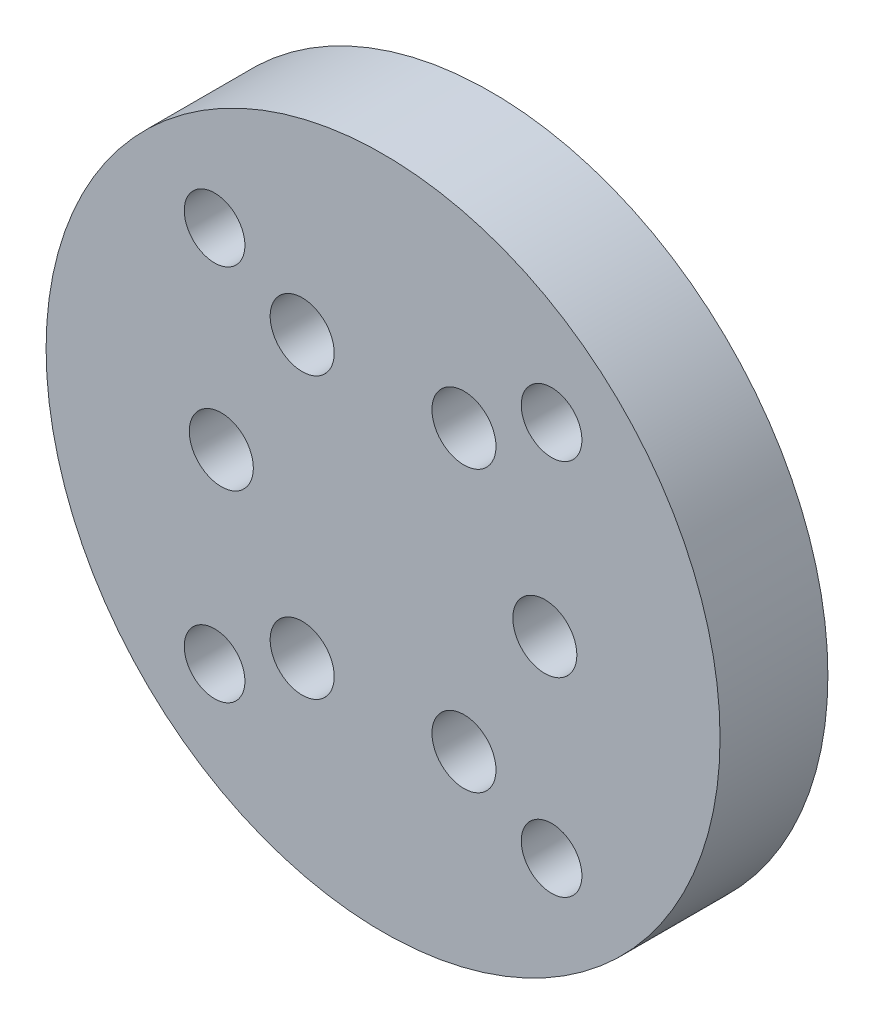
ISO-10303-21;
HEADER;
FILE_DESCRIPTION(('STEP AP214'),'2;1');
FILE_NAME('part.step','',(''),(''),'','','');
FILE_SCHEMA(('AUTOMOTIVE_DESIGN { 1 0 10303 214 1 1 1 1 }'));
ENDSEC;
DATA;
#1=APPLICATION_CONTEXT('core data for automotive mechanical design processes');
#2=APPLICATION_PROTOCOL_DEFINITION('international standard','automotive_design',2000,#1);
#3=PRODUCT_CONTEXT('',#1,'mechanical');
#4=PRODUCT('Part','Part','',(#3));
#5=PRODUCT_RELATED_PRODUCT_CATEGORY('part','',(#4));
#6=PRODUCT_DEFINITION_FORMATION('','',#4);
#7=PRODUCT_DEFINITION_CONTEXT('part definition',#1,'design');
#8=PRODUCT_DEFINITION('design','',#6,#7);
#9=PRODUCT_DEFINITION_SHAPE('','',#8);
#10=(LENGTH_UNIT() NAMED_UNIT(*) SI_UNIT(.MILLI.,.METRE.));
#11=(NAMED_UNIT(*) PLANE_ANGLE_UNIT() SI_UNIT($,.RADIAN.));
#12=(NAMED_UNIT(*) SI_UNIT($,.STERADIAN.) SOLID_ANGLE_UNIT());
#13=UNCERTAINTY_MEASURE_WITH_UNIT(LENGTH_MEASURE(1.E-05),#10,'distance_accuracy_value','');
#14=(GEOMETRIC_REPRESENTATION_CONTEXT(3) GLOBAL_UNCERTAINTY_ASSIGNED_CONTEXT((#13)) GLOBAL_UNIT_ASSIGNED_CONTEXT((#10,
#11,#12)) REPRESENTATION_CONTEXT('',''));
#15=CARTESIAN_POINT('',(0.,0.,0.));
#16=DIRECTION('',(0.,0.,1.));
#17=DIRECTION('',(1.,0.,0.));
#18=AXIS2_PLACEMENT_3D('',#15,#16,#17);
#19=CARTESIAN_POINT('',(0.,0.,0.));
#20=DIRECTION('',(0.,0.,1.));
#21=DIRECTION('',(1.,0.,0.));
#22=AXIS2_PLACEMENT_3D('',#19,#20,#21);
#23=PLANE('',#22);
#24=CARTESIAN_POINT('',(8.97198777937125,-11.4071264548756,0.));
#25=DIRECTION('',(0.,0.,1.));
#26=DIRECTION('',(1.,0.,0.));
#27=AXIS2_PLACEMENT_3D('',#24,#25,#26);
#28=CIRCLE('',#27,4.025);
#29=CARTESIAN_POINT('',(12.9969877793712,-11.4071264548756,0.));
#30=VERTEX_POINT('',#29);
#31=EDGE_CURVE('E388',#30,#30,#28,.T.);
#32=ORIENTED_EDGE('',*,*,#31,.T.);
#33=EDGE_LOOP('',(#32));
#34=FACE_BOUND('',#33,.T.);
#35=CARTESIAN_POINT('',(2.97198777937125,-21.7994313002889,0.));
#36=DIRECTION('',(0.,0.,1.));
#37=DIRECTION('',(1.,0.,0.));
#38=AXIS2_PLACEMENT_3D('',#35,#36,#37);
#39=CIRCLE('',#38,4.02500000000004);
#40=CARTESIAN_POINT('',(6.99698777937129,-21.7994313002889,0.));
#41=VERTEX_POINT('',#40);
#42=EDGE_CURVE('E274',#41,#41,#39,.T.);
#43=ORIENTED_EDGE('',*,*,#42,.T.);
#44=EDGE_LOOP('',(#43));
#45=FACE_BOUND('',#44,.T.);
#46=CARTESIAN_POINT('',(-9.02801222062875,-21.7994313002889,0.));
#47=DIRECTION('',(0.,0.,1.));
#48=DIRECTION('',(1.,0.,0.));
#49=AXIS2_PLACEMENT_3D('',#46,#47,#48);
#50=CIRCLE('',#49,4.02500000000004);
#51=CARTESIAN_POINT('',(-5.00301222062871,-21.7994313002889,0.));
#52=VERTEX_POINT('',#51);
#53=EDGE_CURVE('E261',#52,#52,#50,.T.);
#54=ORIENTED_EDGE('',*,*,#53,.T.);
#55=EDGE_LOOP('',(#54));
#56=FACE_BOUND('',#55,.T.);
#57=CARTESIAN_POINT('',(-9.02801222062876,-1.01482160946231,0.));
#58=DIRECTION('',(0.,0.,1.));
#59=DIRECTION('',(1.,0.,0.));
#60=AXIS2_PLACEMENT_3D('',#57,#58,#59);
#61=CIRCLE('',#60,4.025);
#62=CARTESIAN_POINT('',(-5.00301222062876,-1.01482160946231,0.));
#63=VERTEX_POINT('',#62);
#64=EDGE_CURVE('E268',#63,#63,#61,.T.);
#65=ORIENTED_EDGE('',*,*,#64,.T.);
#66=EDGE_LOOP('',(#65));
#67=FACE_BOUND('',#66,.T.);
#68=CARTESIAN_POINT('',(-15.0280122206288,-11.4071264548756,0.));
#69=DIRECTION('',(0.,0.,1.));
#70=DIRECTION('',(1.,0.,0.));
#71=AXIS2_PLACEMENT_3D('',#68,#69,#70);
#72=CIRCLE('',#71,4.02500000000001);
#73=CARTESIAN_POINT('',(-11.0030122206287,-11.4071264548756,0.));
#74=VERTEX_POINT('',#73);
#75=EDGE_CURVE('E382',#74,#74,#72,.T.);
#76=ORIENTED_EDGE('',*,*,#75,.T.);
#77=EDGE_LOOP('',(#76));
#78=FACE_BOUND('',#77,.T.);
#79=CARTESIAN_POINT('',(2.97198777937125,-1.01482160946231,0.));
#80=DIRECTION('',(0.,0.,1.));
#81=DIRECTION('',(1.,0.,0.));
#82=AXIS2_PLACEMENT_3D('',#79,#80,#81);
#83=CIRCLE('',#82,4.025);
#84=CARTESIAN_POINT('',(6.99698777937125,-1.01482160946231,0.));
#85=VERTEX_POINT('',#84);
#86=EDGE_CURVE('E164',#85,#85,#83,.T.);
#87=ORIENTED_EDGE('',*,*,#86,.T.);
#88=EDGE_LOOP('',(#87));
#89=FACE_BOUND('',#88,.T.);
#90=CARTESIAN_POINT('',(-3.02801222062875,-11.4071264548756,0.));
#91=DIRECTION('',(0.,0.,1.));
#92=DIRECTION('',(1.,0.,0.));
#93=AXIS2_PLACEMENT_3D('',#90,#91,#92);
#94=CIRCLE('',#93,25.);
#95=CARTESIAN_POINT('',(21.9719877793712,-11.4071264548756,0.));
#96=VERTEX_POINT('',#95);
#97=EDGE_CURVE('E98',#96,#96,#94,.T.);
#98=ORIENTED_EDGE('',*,*,#97,.F.);
#99=EDGE_LOOP('',(#98));
#100=FACE_BOUND('',#99,.T.);
#101=CARTESIAN_POINT('',(9.47198777937125,2.5928735451244,-1.20000000006226E-05));
#102=DIRECTION('',(0.,0.,-1.));
#103=DIRECTION('',(-1.,0.,0.));
#104=AXIS2_PLACEMENT_3D('',#101,#102,#103);
#105=CIRCLE('',#104,2.25);
#106=CARTESIAN_POINT('',(7.22198777937125,2.5928735451244,-1.20000000006226E-05));
#107=VERTEX_POINT('',#106);
#108=EDGE_CURVE('E102',#107,#107,#105,.T.);
#109=ORIENTED_EDGE('',*,*,#108,.F.);
#110=EDGE_LOOP('',(#109));
#111=FACE_BOUND('',#110,.T.);
#112=CARTESIAN_POINT('',(-15.5280122206287,2.5928735451244,-1.20000000006226E-05));
#113=DIRECTION('',(0.,0.,-1.));
#114=DIRECTION('',(-1.,0.,0.));
#115=AXIS2_PLACEMENT_3D('',#112,#113,#114);
#116=CIRCLE('',#115,2.25);
#117=CARTESIAN_POINT('',(-17.7780122206287,2.5928735451244,-1.20000000006226E-05));
#118=VERTEX_POINT('',#117);
#119=EDGE_CURVE('E292',#118,#118,#116,.T.);
#120=ORIENTED_EDGE('',*,*,#119,.F.);
#121=EDGE_LOOP('',(#120));
#122=FACE_BOUND('',#121,.T.);
#123=CARTESIAN_POINT('',(-15.5280122206287,-25.4071264548756,-1.20000000006226E-05));
#124=DIRECTION('',(0.,0.,-1.));
#125=DIRECTION('',(-1.,0.,0.));
#126=AXIS2_PLACEMENT_3D('',#123,#124,#125);
#127=CIRCLE('',#126,2.25);
#128=CARTESIAN_POINT('',(-17.7780122206287,-25.4071264548756,-1.20000000006226E-05));
#129=VERTEX_POINT('',#128);
#130=EDGE_CURVE('E142',#129,#129,#127,.T.);
#131=ORIENTED_EDGE('',*,*,#130,.F.);
#132=EDGE_LOOP('',(#131));
#133=FACE_BOUND('',#132,.T.);
#134=CARTESIAN_POINT('',(9.47198777937125,-25.4071264548756,-1.20000000006226E-05));
#135=DIRECTION('',(0.,0.,-1.));
#136=DIRECTION('',(-1.,0.,0.));
#137=AXIS2_PLACEMENT_3D('',#134,#135,#136);
#138=CIRCLE('',#137,2.25);
#139=CARTESIAN_POINT('',(7.22198777937125,-25.4071264548756,-1.20000000006226E-05));
#140=VERTEX_POINT('',#139);
#141=EDGE_CURVE('E155',#140,#140,#138,.T.);
#142=ORIENTED_EDGE('',*,*,#141,.F.);
#143=EDGE_LOOP('',(#142));
#144=FACE_BOUND('',#143,.T.);
#145=ADVANCED_FACE('F80',(#34,#45,#56,#67,#78,#89,#100,#111,#122,#133,#144),#23,.F.);
#146=CARTESIAN_POINT('',(-9.02801222062876,-1.01482160946231,8.));
#147=DIRECTION('',(0.,0.,-1.));
#148=DIRECTION('',(-1.,0.,0.));
#149=AXIS2_PLACEMENT_3D('',#146,#147,#148);
#150=CYLINDRICAL_SURFACE('',#149,2.375);
#151=CARTESIAN_POINT('',(-9.02801222062876,-1.01482160946231,4.));
#152=DIRECTION('',(0.,0.,1.));
#153=DIRECTION('',(1.,0.,0.));
#154=AXIS2_PLACEMENT_3D('',#151,#152,#153);
#155=CIRCLE('',#154,2.375);
#156=CARTESIAN_POINT('',(-6.65301222062875,-1.01482160946231,4.));
#157=VERTEX_POINT('',#156);
#158=EDGE_CURVE('E276',#157,#157,#155,.T.);
#159=ORIENTED_EDGE('',*,*,#158,.F.);
#160=EDGE_LOOP('',(#159));
#161=FACE_BOUND('',#160,.T.);
#162=CARTESIAN_POINT('',(-9.02801222062876,-1.01482160946231,8.));
#163=DIRECTION('',(0.,0.,1.));
#164=DIRECTION('',(1.,0.,0.));
#165=AXIS2_PLACEMENT_3D('',#162,#163,#164);
#166=CIRCLE('',#165,2.375);
#167=CARTESIAN_POINT('',(-6.65301222062875,-1.01482160946231,8.));
#168=VERTEX_POINT('',#167);
#169=EDGE_CURVE('E90',#168,#168,#166,.T.);
#170=ORIENTED_EDGE('',*,*,#169,.T.);
#171=EDGE_LOOP('',(#170));
#172=FACE_BOUND('',#171,.T.);
#173=ADVANCED_FACE('F119',(#161,#172),#150,.F.);
#174=CARTESIAN_POINT('',(2.97198777937125,-1.01482160946231,8.));
#175=DIRECTION('',(0.,0.,-1.));
#176=DIRECTION('',(-1.,0.,0.));
#177=AXIS2_PLACEMENT_3D('',#174,#175,#176);
#178=CYLINDRICAL_SURFACE('',#177,2.375);
#179=CARTESIAN_POINT('',(2.97198777937125,-1.01482160946231,4.));
#180=DIRECTION('',(0.,0.,1.));
#181=DIRECTION('',(1.,0.,0.));
#182=AXIS2_PLACEMENT_3D('',#179,#180,#181);
#183=CIRCLE('',#182,2.375);
#184=CARTESIAN_POINT('',(5.34698777937125,-1.01482160946231,4.));
#185=VERTEX_POINT('',#184);
#186=EDGE_CURVE('E282',#185,#185,#183,.T.);
#187=ORIENTED_EDGE('',*,*,#186,.F.);
#188=EDGE_LOOP('',(#187));
#189=FACE_BOUND('',#188,.T.);
#190=CARTESIAN_POINT('',(2.97198777937125,-1.01482160946231,8.));
#191=DIRECTION('',(0.,0.,1.));
#192=DIRECTION('',(1.,0.,0.));
#193=AXIS2_PLACEMENT_3D('',#190,#191,#192);
#194=CIRCLE('',#193,2.375);
#195=CARTESIAN_POINT('',(5.34698777937125,-1.01482160946231,8.));
#196=VERTEX_POINT('',#195);
#197=EDGE_CURVE('E95',#196,#196,#194,.T.);
#198=ORIENTED_EDGE('',*,*,#197,.T.);
#199=EDGE_LOOP('',(#198));
#200=FACE_BOUND('',#199,.T.);
#201=ADVANCED_FACE('F219',(#189,#200),#178,.F.);
#202=CARTESIAN_POINT('',(8.97198777937125,-11.4071264548756,8.));
#203=DIRECTION('',(0.,0.,-1.));
#204=DIRECTION('',(-1.,0.,0.));
#205=AXIS2_PLACEMENT_3D('',#202,#203,#204);
#206=CYLINDRICAL_SURFACE('',#205,2.375);
#207=CARTESIAN_POINT('',(8.97198777937125,-11.4071264548756,4.));
#208=DIRECTION('',(0.,0.,1.));
#209=DIRECTION('',(1.,0.,0.));
#210=AXIS2_PLACEMENT_3D('',#207,#208,#209);
#211=CIRCLE('',#210,2.375);
#212=CARTESIAN_POINT('',(11.3469877793713,-11.4071264548756,4.));
#213=VERTEX_POINT('',#212);
#214=EDGE_CURVE('E390',#213,#213,#211,.T.);
#215=ORIENTED_EDGE('',*,*,#214,.F.);
#216=EDGE_LOOP('',(#215));
#217=FACE_BOUND('',#216,.T.);
#218=CARTESIAN_POINT('',(8.97198777937125,-11.4071264548756,8.));
#219=DIRECTION('',(0.,0.,1.));
#220=DIRECTION('',(1.,0.,0.));
#221=AXIS2_PLACEMENT_3D('',#218,#219,#220);
#222=CIRCLE('',#221,2.375);
#223=CARTESIAN_POINT('',(11.3469877793713,-11.4071264548756,8.));
#224=VERTEX_POINT('',#223);
#225=EDGE_CURVE('E211',#224,#224,#222,.T.);
#226=ORIENTED_EDGE('',*,*,#225,.T.);
#227=EDGE_LOOP('',(#226));
#228=FACE_BOUND('',#227,.T.);
#229=ADVANCED_FACE('F233',(#217,#228),#206,.F.);
#230=CARTESIAN_POINT('',(2.97198777937125,-21.7994313002889,8.));
#231=DIRECTION('',(0.,0.,-1.));
#232=DIRECTION('',(-1.,0.,0.));
#233=AXIS2_PLACEMENT_3D('',#230,#231,#232);
#234=CYLINDRICAL_SURFACE('',#233,2.37500000000004);
#235=CARTESIAN_POINT('',(2.97198777937125,-21.7994313002889,4.));
#236=DIRECTION('',(0.,0.,1.));
#237=DIRECTION('',(1.,0.,0.));
#238=AXIS2_PLACEMENT_3D('',#235,#236,#237);
#239=CIRCLE('',#238,2.37500000000004);
#240=CARTESIAN_POINT('',(5.34698777937129,-21.7994313002889,4.));
#241=VERTEX_POINT('',#240);
#242=EDGE_CURVE('E280',#241,#241,#239,.T.);
#243=ORIENTED_EDGE('',*,*,#242,.F.);
#244=EDGE_LOOP('',(#243));
#245=FACE_BOUND('',#244,.T.);
#246=CARTESIAN_POINT('',(2.97198777937125,-21.7994313002889,8.));
#247=DIRECTION('',(0.,0.,1.));
#248=DIRECTION('',(1.,0.,0.));
#249=AXIS2_PLACEMENT_3D('',#246,#247,#248);
#250=CIRCLE('',#249,2.37500000000004);
#251=CARTESIAN_POINT('',(5.34698777937129,-21.7994313002889,8.));
#252=VERTEX_POINT('',#251);
#253=EDGE_CURVE('E212',#252,#252,#250,.T.);
#254=ORIENTED_EDGE('',*,*,#253,.T.);
#255=EDGE_LOOP('',(#254));
#256=FACE_BOUND('',#255,.T.);
#257=ADVANCED_FACE('F238',(#245,#256),#234,.F.);
#258=CARTESIAN_POINT('',(-9.02801222062875,-21.7994313002889,8.));
#259=DIRECTION('',(0.,0.,-1.));
#260=DIRECTION('',(-1.,0.,0.));
#261=AXIS2_PLACEMENT_3D('',#258,#259,#260);
#262=CYLINDRICAL_SURFACE('',#261,2.37500000000004);
#263=CARTESIAN_POINT('',(-9.02801222062875,-21.7994313002889,4.));
#264=DIRECTION('',(0.,0.,1.));
#265=DIRECTION('',(1.,0.,0.));
#266=AXIS2_PLACEMENT_3D('',#263,#264,#265);
#267=CIRCLE('',#266,2.37500000000004);
#268=CARTESIAN_POINT('',(-6.65301222062871,-21.7994313002889,4.));
#269=VERTEX_POINT('',#268);
#270=EDGE_CURVE('E254',#269,#269,#267,.T.);
#271=ORIENTED_EDGE('',*,*,#270,.F.);
#272=EDGE_LOOP('',(#271));
#273=FACE_BOUND('',#272,.T.);
#274=CARTESIAN_POINT('',(-9.02801222062875,-21.7994313002889,8.));
#275=DIRECTION('',(0.,0.,1.));
#276=DIRECTION('',(1.,0.,0.));
#277=AXIS2_PLACEMENT_3D('',#274,#275,#276);
#278=CIRCLE('',#277,2.37500000000004);
#279=CARTESIAN_POINT('',(-6.65301222062871,-21.7994313002889,8.));
#280=VERTEX_POINT('',#279);
#281=EDGE_CURVE('E206',#280,#280,#278,.T.);
#282=ORIENTED_EDGE('',*,*,#281,.T.);
#283=EDGE_LOOP('',(#282));
#284=FACE_BOUND('',#283,.T.);
#285=ADVANCED_FACE('F241',(#273,#284),#262,.F.);
#286=CARTESIAN_POINT('',(-3.02801222062875,-11.4071264548756,8.));
#287=DIRECTION('',(0.,0.,-1.));
#288=DIRECTION('',(-1.,0.,0.));
#289=AXIS2_PLACEMENT_3D('',#286,#287,#288);
#290=CYLINDRICAL_SURFACE('',#289,25.);
#291=CARTESIAN_POINT('',(-3.02801222062875,-11.4071264548756,8.));
#292=DIRECTION('',(0.,0.,1.));
#293=DIRECTION('',(1.,0.,0.));
#294=AXIS2_PLACEMENT_3D('',#291,#292,#293);
#295=CIRCLE('',#294,25.);
#296=CARTESIAN_POINT('',(21.9719877793712,-11.4071264548756,8.));
#297=VERTEX_POINT('',#296);
#298=EDGE_CURVE('E100',#297,#297,#295,.T.);
#299=ORIENTED_EDGE('',*,*,#298,.F.);
#300=EDGE_LOOP('',(#299));
#301=FACE_BOUND('',#300,.T.);
#302=ORIENTED_EDGE('',*,*,#97,.T.);
#303=EDGE_LOOP('',(#302));
#304=FACE_BOUND('',#303,.T.);
#305=ADVANCED_FACE('F79',(#301,#304),#290,.T.);
#306=CARTESIAN_POINT('',(-15.0280122206288,-11.4071264548756,8.));
#307=DIRECTION('',(0.,0.,-1.));
#308=DIRECTION('',(-1.,0.,0.));
#309=AXIS2_PLACEMENT_3D('',#306,#307,#308);
#310=CYLINDRICAL_SURFACE('',#309,2.37500000000001);
#311=CARTESIAN_POINT('',(-15.0280122206288,-11.4071264548756,4.));
#312=DIRECTION('',(0.,0.,1.));
#313=DIRECTION('',(1.,0.,0.));
#314=AXIS2_PLACEMENT_3D('',#311,#312,#313);
#315=CIRCLE('',#314,2.37500000000001);
#316=CARTESIAN_POINT('',(-12.6530122206287,-11.4071264548756,4.));
#317=VERTEX_POINT('',#316);
#318=EDGE_CURVE('E378',#317,#317,#315,.T.);
#319=ORIENTED_EDGE('',*,*,#318,.F.);
#320=EDGE_LOOP('',(#319));
#321=FACE_BOUND('',#320,.T.);
#322=CARTESIAN_POINT('',(-15.0280122206288,-11.4071264548756,8.));
#323=DIRECTION('',(0.,0.,1.));
#324=DIRECTION('',(1.,0.,0.));
#325=AXIS2_PLACEMENT_3D('',#322,#323,#324);
#326=CIRCLE('',#325,2.37500000000001);
#327=CARTESIAN_POINT('',(-12.6530122206287,-11.4071264548756,8.));
#328=VERTEX_POINT('',#327);
#329=EDGE_CURVE('E11',#328,#328,#326,.T.);
#330=ORIENTED_EDGE('',*,*,#329,.T.);
#331=EDGE_LOOP('',(#330));
#332=FACE_BOUND('',#331,.T.);
#333=ADVANCED_FACE('F121',(#321,#332),#310,.F.);
#334=CARTESIAN_POINT('',(0.,0.,8.));
#335=DIRECTION('',(0.,0.,1.));
#336=DIRECTION('',(1.,0.,0.));
#337=AXIS2_PLACEMENT_3D('',#334,#335,#336);
#338=PLANE('',#337);
#339=CARTESIAN_POINT('',(9.47198777937125,-25.4071264548756,8.));
#340=DIRECTION('',(0.,0.,-1.));
#341=DIRECTION('',(-1.,0.,0.));
#342=AXIS2_PLACEMENT_3D('',#339,#340,#341);
#343=CIRCLE('',#342,2.25);
#344=CARTESIAN_POINT('',(7.22198777937125,-25.4071264548756,8.));
#345=VERTEX_POINT('',#344);
#346=EDGE_CURVE('E158',#345,#345,#343,.T.);
#347=ORIENTED_EDGE('',*,*,#346,.T.);
#348=EDGE_LOOP('',(#347));
#349=FACE_BOUND('',#348,.T.);
#350=CARTESIAN_POINT('',(-15.5280122206287,-25.4071264548756,8.));
#351=DIRECTION('',(0.,0.,-1.));
#352=DIRECTION('',(-1.,0.,0.));
#353=AXIS2_PLACEMENT_3D('',#350,#351,#352);
#354=CIRCLE('',#353,2.25);
#355=CARTESIAN_POINT('',(-17.7780122206287,-25.4071264548756,8.));
#356=VERTEX_POINT('',#355);
#357=EDGE_CURVE('E152',#356,#356,#354,.T.);
#358=ORIENTED_EDGE('',*,*,#357,.T.);
#359=EDGE_LOOP('',(#358));
#360=FACE_BOUND('',#359,.T.);
#361=CARTESIAN_POINT('',(-15.5280122206287,2.5928735451244,8.));
#362=DIRECTION('',(0.,0.,-1.));
#363=DIRECTION('',(-1.,0.,0.));
#364=AXIS2_PLACEMENT_3D('',#361,#362,#363);
#365=CIRCLE('',#364,2.25);
#366=CARTESIAN_POINT('',(-17.7780122206287,2.5928735451244,8.));
#367=VERTEX_POINT('',#366);
#368=EDGE_CURVE('E287',#367,#367,#365,.T.);
#369=ORIENTED_EDGE('',*,*,#368,.T.);
#370=EDGE_LOOP('',(#369));
#371=FACE_BOUND('',#370,.T.);
#372=CARTESIAN_POINT('',(9.47198777937125,2.5928735451244,8.));
#373=DIRECTION('',(0.,0.,-1.));
#374=DIRECTION('',(-1.,0.,0.));
#375=AXIS2_PLACEMENT_3D('',#372,#373,#374);
#376=CIRCLE('',#375,2.25);
#377=CARTESIAN_POINT('',(7.22198777937125,2.5928735451244,8.));
#378=VERTEX_POINT('',#377);
#379=EDGE_CURVE('E99',#378,#378,#376,.T.);
#380=ORIENTED_EDGE('',*,*,#379,.T.);
#381=EDGE_LOOP('',(#380));
#382=FACE_BOUND('',#381,.T.);
#383=ORIENTED_EDGE('',*,*,#298,.T.);
#384=EDGE_LOOP('',(#383));
#385=FACE_BOUND('',#384,.T.);
#386=ORIENTED_EDGE('',*,*,#281,.F.);
#387=EDGE_LOOP('',(#386));
#388=FACE_BOUND('',#387,.T.);
#389=ORIENTED_EDGE('',*,*,#253,.F.);
#390=EDGE_LOOP('',(#389));
#391=FACE_BOUND('',#390,.T.);
#392=ORIENTED_EDGE('',*,*,#225,.F.);
#393=EDGE_LOOP('',(#392));
#394=FACE_BOUND('',#393,.T.);
#395=ORIENTED_EDGE('',*,*,#197,.F.);
#396=EDGE_LOOP('',(#395));
#397=FACE_BOUND('',#396,.T.);
#398=ORIENTED_EDGE('',*,*,#169,.F.);
#399=EDGE_LOOP('',(#398));
#400=FACE_BOUND('',#399,.T.);
#401=ORIENTED_EDGE('',*,*,#329,.F.);
#402=EDGE_LOOP('',(#401));
#403=FACE_BOUND('',#402,.T.);
#404=ADVANCED_FACE('F125',(#349,#360,#371,#382,#385,#388,#391,#394,#397,#400,#403),#338,.T.);
#405=CARTESIAN_POINT('',(9.47198777937125,2.5928735451244,8.));
#406=DIRECTION('',(0.,0.,-1.));
#407=DIRECTION('',(-1.,0.,0.));
#408=AXIS2_PLACEMENT_3D('',#405,#406,#407);
#409=CYLINDRICAL_SURFACE('',#408,2.25);
#410=ORIENTED_EDGE('',*,*,#379,.F.);
#411=EDGE_LOOP('',(#410));
#412=FACE_BOUND('',#411,.T.);
#413=ORIENTED_EDGE('',*,*,#108,.T.);
#414=EDGE_LOOP('',(#413));
#415=FACE_BOUND('',#414,.T.);
#416=ADVANCED_FACE('F188',(#412,#415),#409,.F.);
#417=CARTESIAN_POINT('',(-15.5280122206287,2.5928735451244,8.));
#418=DIRECTION('',(0.,0.,-1.));
#419=DIRECTION('',(-1.,0.,0.));
#420=AXIS2_PLACEMENT_3D('',#417,#418,#419);
#421=CYLINDRICAL_SURFACE('',#420,2.25);
#422=ORIENTED_EDGE('',*,*,#368,.F.);
#423=EDGE_LOOP('',(#422));
#424=FACE_BOUND('',#423,.T.);
#425=ORIENTED_EDGE('',*,*,#119,.T.);
#426=EDGE_LOOP('',(#425));
#427=FACE_BOUND('',#426,.T.);
#428=ADVANCED_FACE('F194',(#424,#427),#421,.F.);
#429=CARTESIAN_POINT('',(-15.5280122206287,-25.4071264548756,8.));
#430=DIRECTION('',(0.,0.,-1.));
#431=DIRECTION('',(-1.,0.,0.));
#432=AXIS2_PLACEMENT_3D('',#429,#430,#431);
#433=CYLINDRICAL_SURFACE('',#432,2.25);
#434=ORIENTED_EDGE('',*,*,#357,.F.);
#435=EDGE_LOOP('',(#434));
#436=FACE_BOUND('',#435,.T.);
#437=ORIENTED_EDGE('',*,*,#130,.T.);
#438=EDGE_LOOP('',(#437));
#439=FACE_BOUND('',#438,.T.);
#440=ADVANCED_FACE('F187',(#436,#439),#433,.F.);
#441=CARTESIAN_POINT('',(9.47198777937125,-25.4071264548756,8.));
#442=DIRECTION('',(0.,0.,-1.));
#443=DIRECTION('',(-1.,0.,0.));
#444=AXIS2_PLACEMENT_3D('',#441,#442,#443);
#445=CYLINDRICAL_SURFACE('',#444,2.25);
#446=ORIENTED_EDGE('',*,*,#346,.F.);
#447=EDGE_LOOP('',(#446));
#448=FACE_BOUND('',#447,.T.);
#449=ORIENTED_EDGE('',*,*,#141,.T.);
#450=EDGE_LOOP('',(#449));
#451=FACE_BOUND('',#450,.T.);
#452=ADVANCED_FACE('F176',(#448,#451),#445,.F.);
#453=CARTESIAN_POINT('',(-15.0280122206288,-11.4071264548756,4.));
#454=DIRECTION('',(0.,0.,1.));
#455=DIRECTION('',(1.,0.,0.));
#456=AXIS2_PLACEMENT_3D('',#453,#454,#455);
#457=PLANE('',#456);
#458=CARTESIAN_POINT('',(-15.0280122206288,-11.4071264548756,4.));
#459=DIRECTION('',(0.,0.,1.));
#460=DIRECTION('',(1.,0.,0.));
#461=AXIS2_PLACEMENT_3D('',#458,#459,#460);
#462=CIRCLE('',#461,4.02500000000001);
#463=CARTESIAN_POINT('',(-11.0030122206287,-11.4071264548756,4.));
#464=VERTEX_POINT('',#463);
#465=EDGE_CURVE('E283',#464,#464,#462,.T.);
#466=ORIENTED_EDGE('',*,*,#465,.F.);
#467=EDGE_LOOP('',(#466));
#468=FACE_BOUND('',#467,.T.);
#469=ORIENTED_EDGE('',*,*,#318,.T.);
#470=EDGE_LOOP('',(#469));
#471=FACE_BOUND('',#470,.T.);
#472=ADVANCED_FACE('F184',(#468,#471),#457,.F.);
#473=CARTESIAN_POINT('',(-15.0280122206288,-11.4071264548756,4.));
#474=DIRECTION('',(0.,0.,-1.));
#475=DIRECTION('',(-1.,0.,0.));
#476=AXIS2_PLACEMENT_3D('',#473,#474,#475);
#477=CYLINDRICAL_SURFACE('',#476,4.02500000000001);
#478=ORIENTED_EDGE('',*,*,#465,.T.);
#479=EDGE_LOOP('',(#478));
#480=FACE_BOUND('',#479,.T.);
#481=ORIENTED_EDGE('',*,*,#75,.F.);
#482=EDGE_LOOP('',(#481));
#483=FACE_BOUND('',#482,.T.);
#484=ADVANCED_FACE('F353',(#480,#483),#477,.F.);
#485=CARTESIAN_POINT('',(-9.02801222062875,-21.7994313002889,4.));
#486=DIRECTION('',(0.,0.,1.));
#487=DIRECTION('',(1.,0.,0.));
#488=AXIS2_PLACEMENT_3D('',#485,#486,#487);
#489=PLANE('',#488);
#490=CARTESIAN_POINT('',(-9.02801222062875,-21.7994313002889,4.));
#491=DIRECTION('',(0.,0.,1.));
#492=DIRECTION('',(1.,0.,0.));
#493=AXIS2_PLACEMENT_3D('',#490,#491,#492);
#494=CIRCLE('',#493,4.02500000000004);
#495=CARTESIAN_POINT('',(-5.00301222062871,-21.7994313002889,4.));
#496=VERTEX_POINT('',#495);
#497=EDGE_CURVE('E269',#496,#496,#494,.T.);
#498=ORIENTED_EDGE('',*,*,#497,.F.);
#499=EDGE_LOOP('',(#498));
#500=FACE_BOUND('',#499,.T.);
#501=ORIENTED_EDGE('',*,*,#270,.T.);
#502=EDGE_LOOP('',(#501));
#503=FACE_BOUND('',#502,.T.);
#504=ADVANCED_FACE('F350',(#500,#503),#489,.F.);
#505=CARTESIAN_POINT('',(-9.02801222062875,-21.7994313002889,4.));
#506=DIRECTION('',(0.,0.,-1.));
#507=DIRECTION('',(-1.,0.,0.));
#508=AXIS2_PLACEMENT_3D('',#505,#506,#507);
#509=CYLINDRICAL_SURFACE('',#508,4.02500000000004);
#510=ORIENTED_EDGE('',*,*,#497,.T.);
#511=EDGE_LOOP('',(#510));
#512=FACE_BOUND('',#511,.T.);
#513=ORIENTED_EDGE('',*,*,#53,.F.);
#514=EDGE_LOOP('',(#513));
#515=FACE_BOUND('',#514,.T.);
#516=ADVANCED_FACE('F344',(#512,#515),#509,.F.);
#517=CARTESIAN_POINT('',(2.97198777937125,-21.7994313002889,4.));
#518=DIRECTION('',(0.,0.,1.));
#519=DIRECTION('',(1.,0.,0.));
#520=AXIS2_PLACEMENT_3D('',#517,#518,#519);
#521=PLANE('',#520);
#522=CARTESIAN_POINT('',(2.97198777937125,-21.7994313002889,4.));
#523=DIRECTION('',(0.,0.,1.));
#524=DIRECTION('',(1.,0.,0.));
#525=AXIS2_PLACEMENT_3D('',#522,#523,#524);
#526=CIRCLE('',#525,4.02500000000004);
#527=CARTESIAN_POINT('',(6.99698777937129,-21.7994313002889,4.));
#528=VERTEX_POINT('',#527);
#529=EDGE_CURVE('E393',#528,#528,#526,.T.);
#530=ORIENTED_EDGE('',*,*,#529,.F.);
#531=EDGE_LOOP('',(#530));
#532=FACE_BOUND('',#531,.T.);
#533=ORIENTED_EDGE('',*,*,#242,.T.);
#534=EDGE_LOOP('',(#533));
#535=FACE_BOUND('',#534,.T.);
#536=ADVANCED_FACE('F348',(#532,#535),#521,.F.);
#537=CARTESIAN_POINT('',(2.97198777937125,-21.7994313002889,4.));
#538=DIRECTION('',(0.,0.,-1.));
#539=DIRECTION('',(-1.,0.,0.));
#540=AXIS2_PLACEMENT_3D('',#537,#538,#539);
#541=CYLINDRICAL_SURFACE('',#540,4.02500000000004);
#542=ORIENTED_EDGE('',*,*,#529,.T.);
#543=EDGE_LOOP('',(#542));
#544=FACE_BOUND('',#543,.T.);
#545=ORIENTED_EDGE('',*,*,#42,.F.);
#546=EDGE_LOOP('',(#545));
#547=FACE_BOUND('',#546,.T.);
#548=ADVANCED_FACE('F351',(#544,#547),#541,.F.);
#549=CARTESIAN_POINT('',(8.97198777937125,-11.4071264548756,4.));
#550=DIRECTION('',(0.,0.,1.));
#551=DIRECTION('',(1.,0.,0.));
#552=AXIS2_PLACEMENT_3D('',#549,#550,#551);
#553=PLANE('',#552);
#554=CARTESIAN_POINT('',(8.97198777937125,-11.4071264548756,4.));
#555=DIRECTION('',(0.,0.,1.));
#556=DIRECTION('',(1.,0.,0.));
#557=AXIS2_PLACEMENT_3D('',#554,#555,#556);
#558=CIRCLE('',#557,4.025);
#559=CARTESIAN_POINT('',(12.9969877793712,-11.4071264548756,4.));
#560=VERTEX_POINT('',#559);
#561=EDGE_CURVE('E290',#560,#560,#558,.T.);
#562=ORIENTED_EDGE('',*,*,#561,.F.);
#563=EDGE_LOOP('',(#562));
#564=FACE_BOUND('',#563,.T.);
#565=ORIENTED_EDGE('',*,*,#214,.T.);
#566=EDGE_LOOP('',(#565));
#567=FACE_BOUND('',#566,.T.);
#568=ADVANCED_FACE('F358',(#564,#567),#553,.F.);
#569=CARTESIAN_POINT('',(8.97198777937125,-11.4071264548756,4.));
#570=DIRECTION('',(0.,0.,-1.));
#571=DIRECTION('',(-1.,0.,0.));
#572=AXIS2_PLACEMENT_3D('',#569,#570,#571);
#573=CYLINDRICAL_SURFACE('',#572,4.025);
#574=ORIENTED_EDGE('',*,*,#561,.T.);
#575=EDGE_LOOP('',(#574));
#576=FACE_BOUND('',#575,.T.);
#577=ORIENTED_EDGE('',*,*,#31,.F.);
#578=EDGE_LOOP('',(#577));
#579=FACE_BOUND('',#578,.T.);
#580=ADVANCED_FACE('F331',(#576,#579),#573,.F.);
#581=CARTESIAN_POINT('',(2.97198777937125,-1.01482160946231,4.));
#582=DIRECTION('',(0.,0.,1.));
#583=DIRECTION('',(1.,0.,0.));
#584=AXIS2_PLACEMENT_3D('',#581,#582,#583);
#585=PLANE('',#584);
#586=CARTESIAN_POINT('',(2.97198777937125,-1.01482160946231,4.));
#587=DIRECTION('',(0.,0.,1.));
#588=DIRECTION('',(1.,0.,0.));
#589=AXIS2_PLACEMENT_3D('',#586,#587,#588);
#590=CIRCLE('',#589,4.025);
#591=CARTESIAN_POINT('',(6.99698777937125,-1.01482160946231,4.));
#592=VERTEX_POINT('',#591);
#593=EDGE_CURVE('E157',#592,#592,#590,.T.);
#594=ORIENTED_EDGE('',*,*,#593,.F.);
#595=EDGE_LOOP('',(#594));
#596=FACE_BOUND('',#595,.T.);
#597=ORIENTED_EDGE('',*,*,#186,.T.);
#598=EDGE_LOOP('',(#597));
#599=FACE_BOUND('',#598,.T.);
#600=ADVANCED_FACE('F327',(#596,#599),#585,.F.);
#601=CARTESIAN_POINT('',(2.97198777937125,-1.01482160946231,4.));
#602=DIRECTION('',(0.,0.,-1.));
#603=DIRECTION('',(-1.,0.,0.));
#604=AXIS2_PLACEMENT_3D('',#601,#602,#603);
#605=CYLINDRICAL_SURFACE('',#604,4.025);
#606=ORIENTED_EDGE('',*,*,#593,.T.);
#607=EDGE_LOOP('',(#606));
#608=FACE_BOUND('',#607,.T.);
#609=ORIENTED_EDGE('',*,*,#86,.F.);
#610=EDGE_LOOP('',(#609));
#611=FACE_BOUND('',#610,.T.);
#612=ADVANCED_FACE('F328',(#608,#611),#605,.F.);
#613=CARTESIAN_POINT('',(-9.02801222062876,-1.01482160946231,4.));
#614=DIRECTION('',(0.,0.,1.));
#615=DIRECTION('',(1.,0.,0.));
#616=AXIS2_PLACEMENT_3D('',#613,#614,#615);
#617=PLANE('',#616);
#618=CARTESIAN_POINT('',(-9.02801222062876,-1.01482160946231,4.));
#619=DIRECTION('',(0.,0.,1.));
#620=DIRECTION('',(1.,0.,0.));
#621=AXIS2_PLACEMENT_3D('',#618,#619,#620);
#622=CIRCLE('',#621,4.025);
#623=CARTESIAN_POINT('',(-5.00301222062876,-1.01482160946231,4.));
#624=VERTEX_POINT('',#623);
#625=EDGE_CURVE('E264',#624,#624,#622,.T.);
#626=ORIENTED_EDGE('',*,*,#625,.F.);
#627=EDGE_LOOP('',(#626));
#628=FACE_BOUND('',#627,.T.);
#629=ORIENTED_EDGE('',*,*,#158,.T.);
#630=EDGE_LOOP('',(#629));
#631=FACE_BOUND('',#630,.T.);
#632=ADVANCED_FACE('F329',(#628,#631),#617,.F.);
#633=CARTESIAN_POINT('',(-9.02801222062876,-1.01482160946231,4.));
#634=DIRECTION('',(0.,0.,-1.));
#635=DIRECTION('',(-1.,0.,0.));
#636=AXIS2_PLACEMENT_3D('',#633,#634,#635);
#637=CYLINDRICAL_SURFACE('',#636,4.025);
#638=ORIENTED_EDGE('',*,*,#625,.T.);
#639=EDGE_LOOP('',(#638));
#640=FACE_BOUND('',#639,.T.);
#641=ORIENTED_EDGE('',*,*,#64,.F.);
#642=EDGE_LOOP('',(#641));
#643=FACE_BOUND('',#642,.T.);
#644=ADVANCED_FACE('F337',(#640,#643),#637,.F.);
#645=CLOSED_SHELL('',(#145,#173,#201,#229,#257,#285,#305,#333,#404,#416,#428,#440,#452,#472,
#484,#504,#516,#536,#548,#568,#580,#600,#612,#632,#644));
#646=MANIFOLD_SOLID_BREP('B2',#645);
#647=ADVANCED_BREP_SHAPE_REPRESENTATION('',(#18,#646),#14);
#648=SHAPE_DEFINITION_REPRESENTATION(#9,#647);
ENDSEC;
END-ISO-10303-21;
